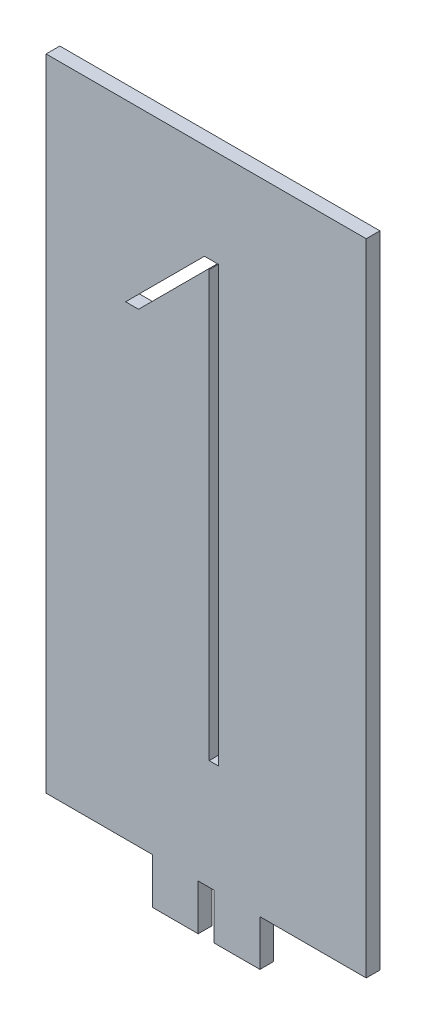
ISO-10303-21;
HEADER;
FILE_DESCRIPTION(('STEP AP214'),'2;1');
FILE_NAME('part.step','',(''),(''),'','','');
FILE_SCHEMA(('AUTOMOTIVE_DESIGN { 1 0 10303 214 1 1 1 1 }'));
ENDSEC;
DATA;
#1=APPLICATION_CONTEXT('core data for automotive mechanical design processes');
#2=APPLICATION_PROTOCOL_DEFINITION('international standard','automotive_design',2000,#1);
#3=PRODUCT_CONTEXT('',#1,'mechanical');
#4=PRODUCT('Part','Part','',(#3));
#5=PRODUCT_RELATED_PRODUCT_CATEGORY('part','',(#4));
#6=PRODUCT_DEFINITION_FORMATION('','',#4);
#7=PRODUCT_DEFINITION_CONTEXT('part definition',#1,'design');
#8=PRODUCT_DEFINITION('design','',#6,#7);
#9=PRODUCT_DEFINITION_SHAPE('','',#8);
#10=(LENGTH_UNIT() NAMED_UNIT(*) SI_UNIT(.MILLI.,.METRE.));
#11=(NAMED_UNIT(*) PLANE_ANGLE_UNIT() SI_UNIT($,.RADIAN.));
#12=(NAMED_UNIT(*) SI_UNIT($,.STERADIAN.) SOLID_ANGLE_UNIT());
#13=UNCERTAINTY_MEASURE_WITH_UNIT(LENGTH_MEASURE(1.E-05),#10,'distance_accuracy_value','');
#14=(GEOMETRIC_REPRESENTATION_CONTEXT(3) GLOBAL_UNCERTAINTY_ASSIGNED_CONTEXT((#13)) GLOBAL_UNIT_ASSIGNED_CONTEXT((#10,
#11,#12)) REPRESENTATION_CONTEXT('',''));
#15=CARTESIAN_POINT('',(0.,0.,0.));
#16=DIRECTION('',(0.,0.,1.));
#17=DIRECTION('',(1.,0.,0.));
#18=AXIS2_PLACEMENT_3D('',#15,#16,#17);
#19=CARTESIAN_POINT('',(0.,0.,1.5));
#20=DIRECTION('',(0.,1.,0.));
#21=DIRECTION('',(0.,0.,1.));
#22=AXIS2_PLACEMENT_3D('',#19,#20,#21);
#23=PLANE('',#22);
#24=DIRECTION('',(1.,0.,0.));
#25=VECTOR('',#24,1.);
#26=CARTESIAN_POINT('',(0.,0.,1.5));
#27=LINE('',#26,#25);
#28=CARTESIAN_POINT('',(11.63,0.,1.5));
#29=VERTEX_POINT('',#28);
#30=CARTESIAN_POINT('',(16.63,0.,1.5));
#31=VERTEX_POINT('',#30);
#32=EDGE_CURVE('E365',#29,#31,#27,.T.);
#33=ORIENTED_EDGE('',*,*,#32,.F.);
#34=DIRECTION('',(0.,0.,1.));
#35=VECTOR('',#34,1.);
#36=CARTESIAN_POINT('',(11.63,0.,0.));
#37=LINE('',#36,#35);
#38=CARTESIAN_POINT('',(11.63,0.,0.));
#39=VERTEX_POINT('',#38);
#40=EDGE_CURVE('E279',#39,#29,#37,.T.);
#41=ORIENTED_EDGE('',*,*,#40,.F.);
#42=DIRECTION('',(1.,0.,0.));
#43=VECTOR('',#42,1.);
#44=CARTESIAN_POINT('',(0.,0.,0.));
#45=LINE('',#44,#43);
#46=CARTESIAN_POINT('',(16.63,0.,0.));
#47=VERTEX_POINT('',#46);
#48=EDGE_CURVE('E379',#39,#47,#45,.T.);
#49=ORIENTED_EDGE('',*,*,#48,.T.);
#50=DIRECTION('',(0.,0.,1.));
#51=VECTOR('',#50,1.);
#52=CARTESIAN_POINT('',(16.63,0.,0.));
#53=LINE('',#52,#51);
#54=EDGE_CURVE('E335',#47,#31,#53,.T.);
#55=ORIENTED_EDGE('',*,*,#54,.T.);
#56=EDGE_LOOP('',(#33,#41,#49,#55));
#57=FACE_BOUND('',#56,.T.);
#58=ADVANCED_FACE('F39',(#57),#23,.F.);
#59=CARTESIAN_POINT('',(0.,0.,1.5));
#60=DIRECTION('',(1.,0.,0.));
#61=DIRECTION('',(0.,1.,0.));
#62=AXIS2_PLACEMENT_3D('',#59,#60,#61);
#63=PLANE('',#62);
#64=DIRECTION('',(0.,-1.,0.));
#65=VECTOR('',#64,1.);
#66=CARTESIAN_POINT('',(0.,0.,0.));
#67=LINE('',#66,#65);
#68=CARTESIAN_POINT('',(0.,75.,0.));
#69=VERTEX_POINT('',#68);
#70=CARTESIAN_POINT('',(0.,5.,0.));
#71=VERTEX_POINT('',#70);
#72=EDGE_CURVE('E291',#69,#71,#67,.T.);
#73=ORIENTED_EDGE('',*,*,#72,.T.);
#74=DIRECTION('',(0.,0.,1.));
#75=VECTOR('',#74,1.);
#76=CARTESIAN_POINT('',(0.,5.,0.));
#77=LINE('',#76,#75);
#78=CARTESIAN_POINT('',(0.,5.,1.5));
#79=VERTEX_POINT('',#78);
#80=EDGE_CURVE('E287',#71,#79,#77,.T.);
#81=ORIENTED_EDGE('',*,*,#80,.T.);
#82=DIRECTION('',(0.,-1.,0.));
#83=VECTOR('',#82,1.);
#84=CARTESIAN_POINT('',(0.,0.,1.5));
#85=LINE('',#84,#83);
#86=CARTESIAN_POINT('',(0.,75.,1.5));
#87=VERTEX_POINT('',#86);
#88=EDGE_CURVE('E356',#87,#79,#85,.T.);
#89=ORIENTED_EDGE('',*,*,#88,.F.);
#90=DIRECTION('',(0.,0.,-1.));
#91=VECTOR('',#90,1.);
#92=CARTESIAN_POINT('',(0.,75.,1.5));
#93=LINE('',#92,#91);
#94=EDGE_CURVE('E48',#87,#69,#93,.T.);
#95=ORIENTED_EDGE('',*,*,#94,.T.);
#96=EDGE_LOOP('',(#73,#81,#89,#95));
#97=FACE_BOUND('',#96,.T.);
#98=ADVANCED_FACE('F41',(#97),#63,.F.);
#99=CARTESIAN_POINT('',(18.38,0.,0.));
#100=VERTEX_POINT('',#99);
#101=CARTESIAN_POINT('',(23.38,0.,0.));
#102=VERTEX_POINT('',#101);
#103=EDGE_CURVE('E375',#100,#102,#45,.T.);
#104=ORIENTED_EDGE('',*,*,#103,.T.);
#105=DIRECTION('',(0.,0.,1.));
#106=VECTOR('',#105,1.);
#107=CARTESIAN_POINT('',(23.38,0.,0.));
#108=LINE('',#107,#106);
#109=CARTESIAN_POINT('',(23.38,0.,1.5));
#110=VERTEX_POINT('',#109);
#111=EDGE_CURVE('E306',#102,#110,#108,.T.);
#112=ORIENTED_EDGE('',*,*,#111,.T.);
#113=CARTESIAN_POINT('',(18.38,0.,1.5));
#114=VERTEX_POINT('',#113);
#115=EDGE_CURVE('E360',#114,#110,#27,.T.);
#116=ORIENTED_EDGE('',*,*,#115,.F.);
#117=DIRECTION('',(0.,0.,1.));
#118=VECTOR('',#117,1.);
#119=CARTESIAN_POINT('',(18.38,0.,0.));
#120=LINE('',#119,#118);
#121=EDGE_CURVE('E350',#100,#114,#120,.T.);
#122=ORIENTED_EDGE('',*,*,#121,.F.);
#123=EDGE_LOOP('',(#104,#112,#116,#122));
#124=FACE_BOUND('',#123,.T.);
#125=ADVANCED_FACE('F423',(#124),#23,.F.);
#126=CARTESIAN_POINT('',(35.,0.,1.5));
#127=DIRECTION('',(-1.,0.,0.));
#128=DIRECTION('',(0.,-1.,0.));
#129=AXIS2_PLACEMENT_3D('',#126,#127,#128);
#130=PLANE('',#129);
#131=DIRECTION('',(0.,1.,0.));
#132=VECTOR('',#131,1.);
#133=CARTESIAN_POINT('',(35.,0.,1.5));
#134=LINE('',#133,#132);
#135=CARTESIAN_POINT('',(35.,5.,1.5));
#136=VERTEX_POINT('',#135);
#137=CARTESIAN_POINT('',(35.,75.,1.5));
#138=VERTEX_POINT('',#137);
#139=EDGE_CURVE('E366',#136,#138,#134,.T.);
#140=ORIENTED_EDGE('',*,*,#139,.F.);
#141=DIRECTION('',(0.,0.,1.));
#142=VECTOR('',#141,1.);
#143=CARTESIAN_POINT('',(35.,5.,0.));
#144=LINE('',#143,#142);
#145=CARTESIAN_POINT('',(35.,5.,0.));
#146=VERTEX_POINT('',#145);
#147=EDGE_CURVE('E316',#146,#136,#144,.T.);
#148=ORIENTED_EDGE('',*,*,#147,.F.);
#149=DIRECTION('',(0.,1.,0.));
#150=VECTOR('',#149,1.);
#151=CARTESIAN_POINT('',(35.,0.,0.));
#152=LINE('',#151,#150);
#153=CARTESIAN_POINT('',(35.,75.,0.));
#154=VERTEX_POINT('',#153);
#155=EDGE_CURVE('E380',#146,#154,#152,.T.);
#156=ORIENTED_EDGE('',*,*,#155,.T.);
#157=DIRECTION('',(0.,0.,-1.));
#158=VECTOR('',#157,1.);
#159=CARTESIAN_POINT('',(35.,75.,1.5));
#160=LINE('',#159,#158);
#161=EDGE_CURVE('E11',#138,#154,#160,.T.);
#162=ORIENTED_EDGE('',*,*,#161,.F.);
#163=EDGE_LOOP('',(#140,#148,#156,#162));
#164=FACE_BOUND('',#163,.T.);
#165=ADVANCED_FACE('F412',(#164),#130,.F.);
#166=CARTESIAN_POINT('',(0.,75.,1.5));
#167=DIRECTION('',(0.,-1.,0.));
#168=DIRECTION('',(0.,0.,-1.));
#169=AXIS2_PLACEMENT_3D('',#166,#167,#168);
#170=PLANE('',#169);
#171=DIRECTION('',(-1.,0.,0.));
#172=VECTOR('',#171,1.);
#173=CARTESIAN_POINT('',(0.,75.,0.));
#174=LINE('',#173,#172);
#175=EDGE_CURVE('E361',#154,#69,#174,.T.);
#176=ORIENTED_EDGE('',*,*,#175,.T.);
#177=ORIENTED_EDGE('',*,*,#94,.F.);
#178=DIRECTION('',(-1.,0.,0.));
#179=VECTOR('',#178,1.);
#180=CARTESIAN_POINT('',(0.,75.,1.5));
#181=LINE('',#180,#179);
#182=EDGE_CURVE('E369',#138,#87,#181,.T.);
#183=ORIENTED_EDGE('',*,*,#182,.F.);
#184=ORIENTED_EDGE('',*,*,#161,.T.);
#185=EDGE_LOOP('',(#176,#177,#183,#184));
#186=FACE_BOUND('',#185,.T.);
#187=ADVANCED_FACE('F410',(#186),#170,.F.);
#188=CARTESIAN_POINT('',(0.,0.,1.5));
#189=DIRECTION('',(0.,0.,-1.));
#190=DIRECTION('',(-1.,0.,0.));
#191=AXIS2_PLACEMENT_3D('',#188,#189,#190);
#192=PLANE('',#191);
#193=DIRECTION('',(0.707106781186548,0.707106781186547,0.));
#194=VECTOR('',#193,1.);
#195=CARTESIAN_POINT('',(17.7313108383654,63.5,1.5));
#196=LINE('',#195,#194);
#197=CARTESIAN_POINT('',(10.1084242078735,55.8771133695081,1.5));
#198=VERTEX_POINT('',#197);
#199=CARTESIAN_POINT('',(17.7313108383654,63.5,1.5));
#200=VERTEX_POINT('',#199);
#201=EDGE_CURVE('E227',#198,#200,#196,.T.);
#202=ORIENTED_EDGE('',*,*,#201,.F.);
#203=DIRECTION('',(1.,0.,0.));
#204=VECTOR('',#203,1.);
#205=CARTESIAN_POINT('',(10.1084242078735,55.8771133695081,1.5));
#206=LINE('',#205,#204);
#207=CARTESIAN_POINT('',(8.69421064550041,55.8771133695081,1.5));
#208=VERTEX_POINT('',#207);
#209=EDGE_CURVE('E55',#208,#198,#206,.T.);
#210=ORIENTED_EDGE('',*,*,#209,.F.);
#211=DIRECTION('',(-0.707106781186548,-0.707106781186548,0.));
#212=VECTOR('',#211,1.);
#213=CARTESIAN_POINT('',(8.69421064550041,55.8771133695081,1.5));
#214=LINE('',#213,#212);
#215=CARTESIAN_POINT('',(17.3170972759923,64.5,1.5));
#216=VERTEX_POINT('',#215);
#217=EDGE_CURVE('E199',#216,#208,#214,.T.);
#218=ORIENTED_EDGE('',*,*,#217,.F.);
#219=DIRECTION('',(-1.,0.,0.));
#220=VECTOR('',#219,1.);
#221=CARTESIAN_POINT('',(17.3170972759923,64.5,1.5));
#222=LINE('',#221,#220);
#223=CARTESIAN_POINT('',(18.8313108383654,64.5,1.5));
#224=VERTEX_POINT('',#223);
#225=EDGE_CURVE('E203',#224,#216,#222,.T.);
#226=ORIENTED_EDGE('',*,*,#225,.F.);
#227=DIRECTION('',(0.,1.,0.));
#228=VECTOR('',#227,1.);
#229=CARTESIAN_POINT('',(18.8313108383654,64.5,1.5));
#230=LINE('',#229,#228);
#231=CARTESIAN_POINT('',(18.8313108383654,17.,1.5));
#232=VERTEX_POINT('',#231);
#233=EDGE_CURVE('E242',#232,#224,#230,.T.);
#234=ORIENTED_EDGE('',*,*,#233,.F.);
#235=DIRECTION('',(1.,0.,0.));
#236=VECTOR('',#235,1.);
#237=CARTESIAN_POINT('',(18.8313108383654,17.,1.5));
#238=LINE('',#237,#236);
#239=CARTESIAN_POINT('',(17.8313108383654,17.,1.5));
#240=VERTEX_POINT('',#239);
#241=EDGE_CURVE('E238',#240,#232,#238,.T.);
#242=ORIENTED_EDGE('',*,*,#241,.F.);
#243=DIRECTION('',(0.,-1.,0.));
#244=VECTOR('',#243,1.);
#245=CARTESIAN_POINT('',(17.8313108383654,17.,1.5));
#246=LINE('',#245,#244);
#247=CARTESIAN_POINT('',(17.8313108383654,63.5,1.5));
#248=VERTEX_POINT('',#247);
#249=EDGE_CURVE('E234',#248,#240,#246,.T.);
#250=ORIENTED_EDGE('',*,*,#249,.F.);
#251=DIRECTION('',(1.,-1.38777878078145E-13,0.));
#252=VECTOR('',#251,1.);
#253=CARTESIAN_POINT('',(17.8313108383654,63.5,1.5));
#254=LINE('',#253,#252);
#255=EDGE_CURVE('E230',#200,#248,#254,.T.);
#256=ORIENTED_EDGE('',*,*,#255,.F.);
#257=EDGE_LOOP('',(#202,#210,#218,#226,#234,#242,#250,#256));
#258=FACE_BOUND('',#257,.T.);
#259=ORIENTED_EDGE('',*,*,#88,.T.);
#260=DIRECTION('',(-1.,0.,0.));
#261=VECTOR('',#260,1.);
#262=CARTESIAN_POINT('',(0.,5.,1.5));
#263=LINE('',#262,#261);
#264=CARTESIAN_POINT('',(11.63,5.,1.5));
#265=VERTEX_POINT('',#264);
#266=EDGE_CURVE('E275',#265,#79,#263,.T.);
#267=ORIENTED_EDGE('',*,*,#266,.F.);
#268=DIRECTION('',(0.,1.,0.));
#269=VECTOR('',#268,1.);
#270=CARTESIAN_POINT('',(11.63,0.,1.5));
#271=LINE('',#270,#269);
#272=EDGE_CURVE('E280',#29,#265,#271,.T.);
#273=ORIENTED_EDGE('',*,*,#272,.F.);
#274=ORIENTED_EDGE('',*,*,#32,.T.);
#275=DIRECTION('',(0.,-1.,0.));
#276=VECTOR('',#275,1.);
#277=CARTESIAN_POINT('',(16.63,0.,1.5));
#278=LINE('',#277,#276);
#279=CARTESIAN_POINT('',(16.63,5.,1.5));
#280=VERTEX_POINT('',#279);
#281=EDGE_CURVE('E252',#280,#31,#278,.T.);
#282=ORIENTED_EDGE('',*,*,#281,.F.);
#283=DIRECTION('',(-1.,0.,0.));
#284=VECTOR('',#283,1.);
#285=CARTESIAN_POINT('',(16.63,5.,1.5));
#286=LINE('',#285,#284);
#287=CARTESIAN_POINT('',(18.38,5.,1.5));
#288=VERTEX_POINT('',#287);
#289=EDGE_CURVE('E327',#288,#280,#286,.T.);
#290=ORIENTED_EDGE('',*,*,#289,.F.);
#291=DIRECTION('',(0.,1.,0.));
#292=VECTOR('',#291,1.);
#293=CARTESIAN_POINT('',(18.38,0.,1.5));
#294=LINE('',#293,#292);
#295=EDGE_CURVE('E338',#114,#288,#294,.T.);
#296=ORIENTED_EDGE('',*,*,#295,.F.);
#297=ORIENTED_EDGE('',*,*,#115,.T.);
#298=DIRECTION('',(0.,-1.,0.));
#299=VECTOR('',#298,1.);
#300=CARTESIAN_POINT('',(23.38,5.,1.5));
#301=LINE('',#300,#299);
#302=CARTESIAN_POINT('',(23.38,5.,1.5));
#303=VERTEX_POINT('',#302);
#304=EDGE_CURVE('E307',#303,#110,#301,.T.);
#305=ORIENTED_EDGE('',*,*,#304,.F.);
#306=DIRECTION('',(-1.,0.,0.));
#307=VECTOR('',#306,1.);
#308=CARTESIAN_POINT('',(23.38,5.,1.5));
#309=LINE('',#308,#307);
#310=EDGE_CURVE('E302',#136,#303,#309,.T.);
#311=ORIENTED_EDGE('',*,*,#310,.F.);
#312=ORIENTED_EDGE('',*,*,#139,.T.);
#313=ORIENTED_EDGE('',*,*,#182,.T.);
#314=EDGE_LOOP('',(#259,#267,#273,#274,#282,#290,#296,#297,#305,#311,#312,#313));
#315=FACE_BOUND('',#314,.T.);
#316=ADVANCED_FACE('F406',(#258,#315),#192,.F.);
#317=CARTESIAN_POINT('',(0.,0.,0.));
#318=DIRECTION('',(0.,0.,-1.));
#319=DIRECTION('',(-1.,0.,0.));
#320=AXIS2_PLACEMENT_3D('',#317,#318,#319);
#321=PLANE('',#320);
#322=DIRECTION('',(1.,0.,0.));
#323=VECTOR('',#322,1.);
#324=CARTESIAN_POINT('',(10.1084242078735,55.8771133695081,0.));
#325=LINE('',#324,#323);
#326=CARTESIAN_POINT('',(8.69421064550041,55.8771133695081,0.));
#327=VERTEX_POINT('',#326);
#328=CARTESIAN_POINT('',(10.1084242078735,55.8771133695081,0.));
#329=VERTEX_POINT('',#328);
#330=EDGE_CURVE('E179',#327,#329,#325,.T.);
#331=ORIENTED_EDGE('',*,*,#330,.T.);
#332=DIRECTION('',(0.707106781186548,0.707106781186547,0.));
#333=VECTOR('',#332,1.);
#334=CARTESIAN_POINT('',(17.7313108383654,63.5,0.));
#335=LINE('',#334,#333);
#336=CARTESIAN_POINT('',(17.7313108383654,63.5,0.));
#337=VERTEX_POINT('',#336);
#338=EDGE_CURVE('E189',#329,#337,#335,.T.);
#339=ORIENTED_EDGE('',*,*,#338,.T.);
#340=DIRECTION('',(1.,-1.38777878078145E-13,0.));
#341=VECTOR('',#340,1.);
#342=CARTESIAN_POINT('',(17.8313108383654,63.5,0.));
#343=LINE('',#342,#341);
#344=CARTESIAN_POINT('',(17.8313108383654,63.5,0.));
#345=VERTEX_POINT('',#344);
#346=EDGE_CURVE('E63',#337,#345,#343,.T.);
#347=ORIENTED_EDGE('',*,*,#346,.T.);
#348=DIRECTION('',(0.,-1.,0.));
#349=VECTOR('',#348,1.);
#350=CARTESIAN_POINT('',(17.8313108383654,17.,0.));
#351=LINE('',#350,#349);
#352=CARTESIAN_POINT('',(17.8313108383654,17.,0.));
#353=VERTEX_POINT('',#352);
#354=EDGE_CURVE('E208',#345,#353,#351,.T.);
#355=ORIENTED_EDGE('',*,*,#354,.T.);
#356=DIRECTION('',(1.,0.,0.));
#357=VECTOR('',#356,1.);
#358=CARTESIAN_POINT('',(18.8313108383654,17.,0.));
#359=LINE('',#358,#357);
#360=CARTESIAN_POINT('',(18.8313108383654,17.,0.));
#361=VERTEX_POINT('',#360);
#362=EDGE_CURVE('E212',#353,#361,#359,.T.);
#363=ORIENTED_EDGE('',*,*,#362,.T.);
#364=DIRECTION('',(0.,1.,0.));
#365=VECTOR('',#364,1.);
#366=CARTESIAN_POINT('',(18.8313108383654,64.5,0.));
#367=LINE('',#366,#365);
#368=CARTESIAN_POINT('',(18.8313108383654,64.5,0.));
#369=VERTEX_POINT('',#368);
#370=EDGE_CURVE('E216',#361,#369,#367,.T.);
#371=ORIENTED_EDGE('',*,*,#370,.T.);
#372=DIRECTION('',(-1.,0.,0.));
#373=VECTOR('',#372,1.);
#374=CARTESIAN_POINT('',(17.3170972759923,64.5,0.));
#375=LINE('',#374,#373);
#376=CARTESIAN_POINT('',(17.3170972759923,64.5,0.));
#377=VERTEX_POINT('',#376);
#378=EDGE_CURVE('E220',#369,#377,#375,.T.);
#379=ORIENTED_EDGE('',*,*,#378,.T.);
#380=DIRECTION('',(-0.707106781186548,-0.707106781186548,0.));
#381=VECTOR('',#380,1.);
#382=CARTESIAN_POINT('',(8.69421064550041,55.8771133695081,0.));
#383=LINE('',#382,#381);
#384=EDGE_CURVE('E186',#377,#327,#383,.T.);
#385=ORIENTED_EDGE('',*,*,#384,.T.);
#386=EDGE_LOOP('',(#331,#339,#347,#355,#363,#371,#379,#385));
#387=FACE_BOUND('',#386,.T.);
#388=DIRECTION('',(-1.,0.,0.));
#389=VECTOR('',#388,1.);
#390=CARTESIAN_POINT('',(0.,5.,0.));
#391=LINE('',#390,#389);
#392=CARTESIAN_POINT('',(11.63,5.,0.));
#393=VERTEX_POINT('',#392);
#394=EDGE_CURVE('E274',#393,#71,#391,.T.);
#395=ORIENTED_EDGE('',*,*,#394,.T.);
#396=ORIENTED_EDGE('',*,*,#72,.F.);
#397=ORIENTED_EDGE('',*,*,#175,.F.);
#398=ORIENTED_EDGE('',*,*,#155,.F.);
#399=DIRECTION('',(-1.,0.,0.));
#400=VECTOR('',#399,1.);
#401=CARTESIAN_POINT('',(23.38,5.,0.));
#402=LINE('',#401,#400);
#403=CARTESIAN_POINT('',(23.38,5.,0.));
#404=VERTEX_POINT('',#403);
#405=EDGE_CURVE('E301',#146,#404,#402,.T.);
#406=ORIENTED_EDGE('',*,*,#405,.T.);
#407=DIRECTION('',(0.,-1.,0.));
#408=VECTOR('',#407,1.);
#409=CARTESIAN_POINT('',(23.38,5.,0.));
#410=LINE('',#409,#408);
#411=EDGE_CURVE('E297',#404,#102,#410,.T.);
#412=ORIENTED_EDGE('',*,*,#411,.T.);
#413=ORIENTED_EDGE('',*,*,#103,.F.);
#414=DIRECTION('',(0.,1.,0.));
#415=VECTOR('',#414,1.);
#416=CARTESIAN_POINT('',(18.38,0.,0.));
#417=LINE('',#416,#415);
#418=CARTESIAN_POINT('',(18.38,5.,0.));
#419=VERTEX_POINT('',#418);
#420=EDGE_CURVE('E326',#100,#419,#417,.T.);
#421=ORIENTED_EDGE('',*,*,#420,.T.);
#422=DIRECTION('',(-1.,0.,0.));
#423=VECTOR('',#422,1.);
#424=CARTESIAN_POINT('',(16.63,5.,0.));
#425=LINE('',#424,#423);
#426=CARTESIAN_POINT('',(16.63,5.,0.));
#427=VERTEX_POINT('',#426);
#428=EDGE_CURVE('E331',#419,#427,#425,.T.);
#429=ORIENTED_EDGE('',*,*,#428,.T.);
#430=DIRECTION('',(0.,-1.,0.));
#431=VECTOR('',#430,1.);
#432=CARTESIAN_POINT('',(16.63,0.,0.));
#433=LINE('',#432,#431);
#434=EDGE_CURVE('E322',#427,#47,#433,.T.);
#435=ORIENTED_EDGE('',*,*,#434,.T.);
#436=ORIENTED_EDGE('',*,*,#48,.F.);
#437=DIRECTION('',(0.,1.,0.));
#438=VECTOR('',#437,1.);
#439=CARTESIAN_POINT('',(11.63,0.,0.));
#440=LINE('',#439,#438);
#441=EDGE_CURVE('E270',#39,#393,#440,.T.);
#442=ORIENTED_EDGE('',*,*,#441,.T.);
#443=EDGE_LOOP('',(#395,#396,#397,#398,#406,#412,#413,#421,#429,#435,#436,#442));
#444=FACE_BOUND('',#443,.T.);
#445=ADVANCED_FACE('F194',(#387,#444),#321,.T.);
#446=CARTESIAN_POINT('',(16.63,0.,0.));
#447=DIRECTION('',(-1.,0.,0.));
#448=DIRECTION('',(0.,0.,1.));
#449=AXIS2_PLACEMENT_3D('',#446,#447,#448);
#450=PLANE('',#449);
#451=ORIENTED_EDGE('',*,*,#281,.T.);
#452=ORIENTED_EDGE('',*,*,#54,.F.);
#453=ORIENTED_EDGE('',*,*,#434,.F.);
#454=DIRECTION('',(0.,0.,1.));
#455=VECTOR('',#454,1.);
#456=CARTESIAN_POINT('',(16.63,5.,0.));
#457=LINE('',#456,#455);
#458=EDGE_CURVE('E310',#427,#280,#457,.T.);
#459=ORIENTED_EDGE('',*,*,#458,.T.);
#460=EDGE_LOOP('',(#451,#452,#453,#459));
#461=FACE_BOUND('',#460,.T.);
#462=ADVANCED_FACE('F436',(#461),#450,.F.);
#463=CARTESIAN_POINT('',(16.63,5.,0.));
#464=DIRECTION('',(0.,1.,0.));
#465=DIRECTION('',(0.,0.,1.));
#466=AXIS2_PLACEMENT_3D('',#463,#464,#465);
#467=PLANE('',#466);
#468=ORIENTED_EDGE('',*,*,#289,.T.);
#469=ORIENTED_EDGE('',*,*,#458,.F.);
#470=ORIENTED_EDGE('',*,*,#428,.F.);
#471=DIRECTION('',(0.,0.,1.));
#472=VECTOR('',#471,1.);
#473=CARTESIAN_POINT('',(18.38,5.,0.));
#474=LINE('',#473,#472);
#475=EDGE_CURVE('E347',#419,#288,#474,.T.);
#476=ORIENTED_EDGE('',*,*,#475,.T.);
#477=EDGE_LOOP('',(#468,#469,#470,#476));
#478=FACE_BOUND('',#477,.T.);
#479=ADVANCED_FACE('F434',(#478),#467,.F.);
#480=CARTESIAN_POINT('',(18.38,0.,0.));
#481=DIRECTION('',(1.,0.,0.));
#482=DIRECTION('',(0.,0.,-1.));
#483=AXIS2_PLACEMENT_3D('',#480,#481,#482);
#484=PLANE('',#483);
#485=ORIENTED_EDGE('',*,*,#295,.T.);
#486=ORIENTED_EDGE('',*,*,#475,.F.);
#487=ORIENTED_EDGE('',*,*,#420,.F.);
#488=ORIENTED_EDGE('',*,*,#121,.T.);
#489=EDGE_LOOP('',(#485,#486,#487,#488));
#490=FACE_BOUND('',#489,.T.);
#491=ADVANCED_FACE('F430',(#490),#484,.F.);
#492=CARTESIAN_POINT('',(23.38,5.,0.));
#493=DIRECTION('',(-1.,0.,0.));
#494=DIRECTION('',(0.,0.,1.));
#495=AXIS2_PLACEMENT_3D('',#492,#493,#494);
#496=PLANE('',#495);
#497=ORIENTED_EDGE('',*,*,#304,.T.);
#498=ORIENTED_EDGE('',*,*,#111,.F.);
#499=ORIENTED_EDGE('',*,*,#411,.F.);
#500=DIRECTION('',(0.,0.,1.));
#501=VECTOR('',#500,1.);
#502=CARTESIAN_POINT('',(23.38,5.,0.));
#503=LINE('',#502,#501);
#504=EDGE_CURVE('E284',#404,#303,#503,.T.);
#505=ORIENTED_EDGE('',*,*,#504,.T.);
#506=EDGE_LOOP('',(#497,#498,#499,#505));
#507=FACE_BOUND('',#506,.T.);
#508=ADVANCED_FACE('F420',(#507),#496,.F.);
#509=CARTESIAN_POINT('',(23.38,5.,0.));
#510=DIRECTION('',(0.,1.,0.));
#511=DIRECTION('',(0.,0.,1.));
#512=AXIS2_PLACEMENT_3D('',#509,#510,#511);
#513=PLANE('',#512);
#514=ORIENTED_EDGE('',*,*,#310,.T.);
#515=ORIENTED_EDGE('',*,*,#504,.F.);
#516=ORIENTED_EDGE('',*,*,#405,.F.);
#517=ORIENTED_EDGE('',*,*,#147,.T.);
#518=EDGE_LOOP('',(#514,#515,#516,#517));
#519=FACE_BOUND('',#518,.T.);
#520=ADVANCED_FACE('F417',(#519),#513,.F.);
#521=CARTESIAN_POINT('',(0.,5.,0.));
#522=DIRECTION('',(0.,1.,0.));
#523=DIRECTION('',(0.,0.,1.));
#524=AXIS2_PLACEMENT_3D('',#521,#522,#523);
#525=PLANE('',#524);
#526=ORIENTED_EDGE('',*,*,#266,.T.);
#527=ORIENTED_EDGE('',*,*,#80,.F.);
#528=ORIENTED_EDGE('',*,*,#394,.F.);
#529=DIRECTION('',(0.,0.,1.));
#530=VECTOR('',#529,1.);
#531=CARTESIAN_POINT('',(11.63,5.,0.));
#532=LINE('',#531,#530);
#533=EDGE_CURVE('E292',#393,#265,#532,.T.);
#534=ORIENTED_EDGE('',*,*,#533,.T.);
#535=EDGE_LOOP('',(#526,#527,#528,#534));
#536=FACE_BOUND('',#535,.T.);
#537=ADVANCED_FACE('F397',(#536),#525,.F.);
#538=CARTESIAN_POINT('',(11.63,0.,0.));
#539=DIRECTION('',(1.,0.,0.));
#540=DIRECTION('',(0.,1.,0.));
#541=AXIS2_PLACEMENT_3D('',#538,#539,#540);
#542=PLANE('',#541);
#543=ORIENTED_EDGE('',*,*,#272,.T.);
#544=ORIENTED_EDGE('',*,*,#533,.F.);
#545=ORIENTED_EDGE('',*,*,#441,.F.);
#546=ORIENTED_EDGE('',*,*,#40,.T.);
#547=EDGE_LOOP('',(#543,#544,#545,#546));
#548=FACE_BOUND('',#547,.T.);
#549=ADVANCED_FACE('F399',(#548),#542,.F.);
#550=CARTESIAN_POINT('',(10.1084242078735,55.8771133695081,0.));
#551=DIRECTION('',(0.,-1.,0.));
#552=DIRECTION('',(0.,0.,-1.));
#553=AXIS2_PLACEMENT_3D('',#550,#551,#552);
#554=PLANE('',#553);
#555=ORIENTED_EDGE('',*,*,#209,.T.);
#556=DIRECTION('',(0.,0.,1.));
#557=VECTOR('',#556,1.);
#558=CARTESIAN_POINT('',(10.1084242078735,55.8771133695081,0.));
#559=LINE('',#558,#557);
#560=EDGE_CURVE('E175',#329,#198,#559,.T.);
#561=ORIENTED_EDGE('',*,*,#560,.F.);
#562=ORIENTED_EDGE('',*,*,#330,.F.);
#563=DIRECTION('',(0.,0.,1.));
#564=VECTOR('',#563,1.);
#565=CARTESIAN_POINT('',(8.69421064550041,55.8771133695081,0.));
#566=LINE('',#565,#564);
#567=EDGE_CURVE('E249',#327,#208,#566,.T.);
#568=ORIENTED_EDGE('',*,*,#567,.T.);
#569=EDGE_LOOP('',(#555,#561,#562,#568));
#570=FACE_BOUND('',#569,.T.);
#571=ADVANCED_FACE('F177',(#570),#554,.F.);
#572=CARTESIAN_POINT('',(8.69421064550041,55.8771133695081,0.));
#573=DIRECTION('',(-0.707106781186547,0.707106781186547,0.));
#574=DIRECTION('',(-0.707106781186548,-0.707106781186548,0.));
#575=AXIS2_PLACEMENT_3D('',#572,#573,#574);
#576=PLANE('',#575);
#577=ORIENTED_EDGE('',*,*,#217,.T.);
#578=ORIENTED_EDGE('',*,*,#567,.F.);
#579=ORIENTED_EDGE('',*,*,#384,.F.);
#580=DIRECTION('',(0.,0.,1.));
#581=VECTOR('',#580,1.);
#582=CARTESIAN_POINT('',(17.3170972759923,64.5,0.));
#583=LINE('',#582,#581);
#584=EDGE_CURVE('E253',#377,#216,#583,.T.);
#585=ORIENTED_EDGE('',*,*,#584,.T.);
#586=EDGE_LOOP('',(#577,#578,#579,#585));
#587=FACE_BOUND('',#586,.T.);
#588=ADVANCED_FACE('F475',(#587),#576,.F.);
#589=CARTESIAN_POINT('',(17.3170972759923,64.5,0.));
#590=DIRECTION('',(0.,1.,0.));
#591=DIRECTION('',(0.,0.,1.));
#592=AXIS2_PLACEMENT_3D('',#589,#590,#591);
#593=PLANE('',#592);
#594=ORIENTED_EDGE('',*,*,#225,.T.);
#595=ORIENTED_EDGE('',*,*,#584,.F.);
#596=ORIENTED_EDGE('',*,*,#378,.F.);
#597=DIRECTION('',(0.,0.,1.));
#598=VECTOR('',#597,1.);
#599=CARTESIAN_POINT('',(18.8313108383654,64.5,0.));
#600=LINE('',#599,#598);
#601=EDGE_CURVE('E256',#369,#224,#600,.T.);
#602=ORIENTED_EDGE('',*,*,#601,.T.);
#603=EDGE_LOOP('',(#594,#595,#596,#602));
#604=FACE_BOUND('',#603,.T.);
#605=ADVANCED_FACE('F492',(#604),#593,.F.);
#606=CARTESIAN_POINT('',(18.8313108383654,64.5,0.));
#607=DIRECTION('',(1.,0.,0.));
#608=DIRECTION('',(0.,1.,0.));
#609=AXIS2_PLACEMENT_3D('',#606,#607,#608);
#610=PLANE('',#609);
#611=ORIENTED_EDGE('',*,*,#233,.T.);
#612=ORIENTED_EDGE('',*,*,#601,.F.);
#613=ORIENTED_EDGE('',*,*,#370,.F.);
#614=DIRECTION('',(0.,0.,1.));
#615=VECTOR('',#614,1.);
#616=CARTESIAN_POINT('',(18.8313108383654,17.,0.));
#617=LINE('',#616,#615);
#618=EDGE_CURVE('E259',#361,#232,#617,.T.);
#619=ORIENTED_EDGE('',*,*,#618,.T.);
#620=EDGE_LOOP('',(#611,#612,#613,#619));
#621=FACE_BOUND('',#620,.T.);
#622=ADVANCED_FACE('F488',(#621),#610,.F.);
#623=CARTESIAN_POINT('',(18.8313108383654,17.,0.));
#624=DIRECTION('',(0.,-1.,0.));
#625=DIRECTION('',(0.,0.,-1.));
#626=AXIS2_PLACEMENT_3D('',#623,#624,#625);
#627=PLANE('',#626);
#628=ORIENTED_EDGE('',*,*,#241,.T.);
#629=ORIENTED_EDGE('',*,*,#618,.F.);
#630=ORIENTED_EDGE('',*,*,#362,.F.);
#631=DIRECTION('',(0.,0.,1.));
#632=VECTOR('',#631,1.);
#633=CARTESIAN_POINT('',(17.8313108383654,17.,0.));
#634=LINE('',#633,#632);
#635=EDGE_CURVE('E262',#353,#240,#634,.T.);
#636=ORIENTED_EDGE('',*,*,#635,.T.);
#637=EDGE_LOOP('',(#628,#629,#630,#636));
#638=FACE_BOUND('',#637,.T.);
#639=ADVANCED_FACE('F484',(#638),#627,.F.);
#640=CARTESIAN_POINT('',(17.8313108383654,17.,0.));
#641=DIRECTION('',(-1.,0.,0.));
#642=DIRECTION('',(0.,0.,1.));
#643=AXIS2_PLACEMENT_3D('',#640,#641,#642);
#644=PLANE('',#643);
#645=ORIENTED_EDGE('',*,*,#249,.T.);
#646=ORIENTED_EDGE('',*,*,#635,.F.);
#647=ORIENTED_EDGE('',*,*,#354,.F.);
#648=DIRECTION('',(0.,0.,1.));
#649=VECTOR('',#648,1.);
#650=CARTESIAN_POINT('',(17.8313108383654,63.5,0.));
#651=LINE('',#650,#649);
#652=EDGE_CURVE('E265',#345,#248,#651,.T.);
#653=ORIENTED_EDGE('',*,*,#652,.T.);
#654=EDGE_LOOP('',(#645,#646,#647,#653));
#655=FACE_BOUND('',#654,.T.);
#656=ADVANCED_FACE('F481',(#655),#644,.F.);
#657=CARTESIAN_POINT('',(17.8313108383654,63.5,0.));
#658=DIRECTION('',(-1.38777878078145E-13,-1.,0.));
#659=DIRECTION('',(1.,-1.38777878078145E-13,0.));
#660=AXIS2_PLACEMENT_3D('',#657,#658,#659);
#661=PLANE('',#660);
#662=ORIENTED_EDGE('',*,*,#255,.T.);
#663=ORIENTED_EDGE('',*,*,#652,.F.);
#664=ORIENTED_EDGE('',*,*,#346,.F.);
#665=DIRECTION('',(0.,0.,1.));
#666=VECTOR('',#665,1.);
#667=CARTESIAN_POINT('',(17.7313108383654,63.5,0.));
#668=LINE('',#667,#666);
#669=EDGE_CURVE('E185',#337,#200,#668,.T.);
#670=ORIENTED_EDGE('',*,*,#669,.T.);
#671=EDGE_LOOP('',(#662,#663,#664,#670));
#672=FACE_BOUND('',#671,.T.);
#673=ADVANCED_FACE('F478',(#672),#661,.F.);
#674=CARTESIAN_POINT('',(17.7313108383654,63.5,0.));
#675=DIRECTION('',(0.707106781186547,-0.707106781186548,0.));
#676=DIRECTION('',(0.707106781186548,0.707106781186547,0.));
#677=AXIS2_PLACEMENT_3D('',#674,#675,#676);
#678=PLANE('',#677);
#679=ORIENTED_EDGE('',*,*,#201,.T.);
#680=ORIENTED_EDGE('',*,*,#669,.F.);
#681=ORIENTED_EDGE('',*,*,#338,.F.);
#682=ORIENTED_EDGE('',*,*,#560,.T.);
#683=EDGE_LOOP('',(#679,#680,#681,#682));
#684=FACE_BOUND('',#683,.T.);
#685=ADVANCED_FACE('F190',(#684),#678,.F.);
#686=CLOSED_SHELL('',(#58,#98,#125,#165,#187,#316,#445,#462,#479,#491,#508,#520,#537,#549,#571,
#588,#605,#622,#639,#656,#673,#685));
#687=MANIFOLD_SOLID_BREP('B2',#686);
#688=ADVANCED_BREP_SHAPE_REPRESENTATION('',(#18,#687),#14);
#689=SHAPE_DEFINITION_REPRESENTATION(#9,#688);
ENDSEC;
END-ISO-10303-21;
